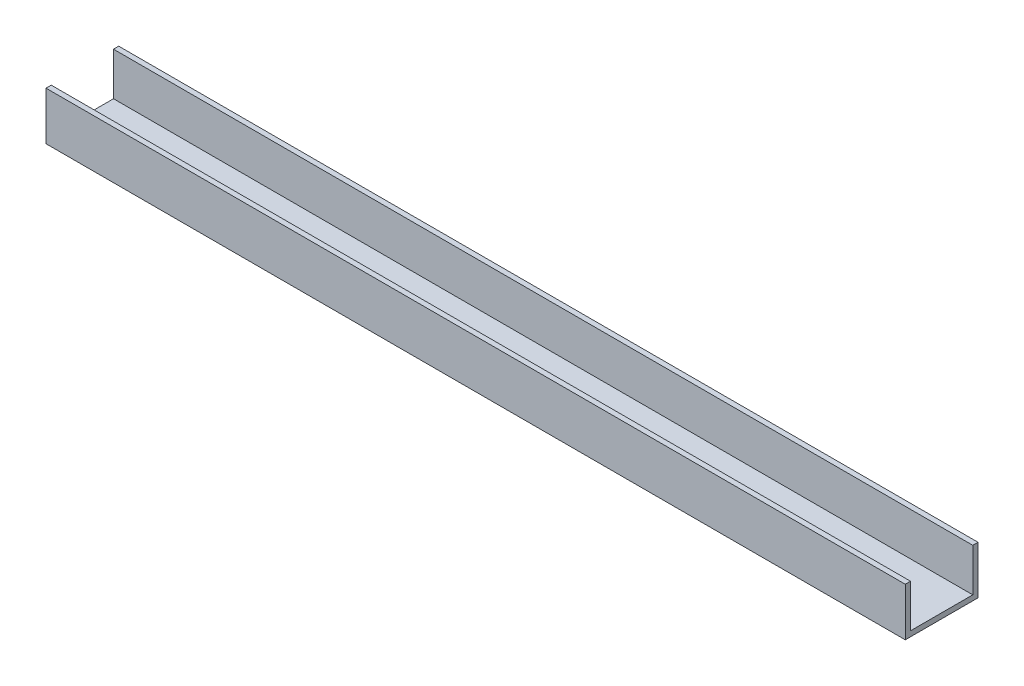
ISO-10303-21;
HEADER;
FILE_DESCRIPTION(('STEP AP214'),'2;1');
FILE_NAME('part.step','',(''),(''),'','','');
FILE_SCHEMA(('AUTOMOTIVE_DESIGN { 1 0 10303 214 1 1 1 1 }'));
ENDSEC;
DATA;
#1=APPLICATION_CONTEXT('core data for automotive mechanical design processes');
#2=APPLICATION_PROTOCOL_DEFINITION('international standard','automotive_design',2000,#1);
#3=PRODUCT_CONTEXT('',#1,'mechanical');
#4=PRODUCT('Part','Part','',(#3));
#5=PRODUCT_RELATED_PRODUCT_CATEGORY('part','',(#4));
#6=PRODUCT_DEFINITION_FORMATION('','',#4);
#7=PRODUCT_DEFINITION_CONTEXT('part definition',#1,'design');
#8=PRODUCT_DEFINITION('design','',#6,#7);
#9=PRODUCT_DEFINITION_SHAPE('','',#8);
#10=(LENGTH_UNIT() NAMED_UNIT(*) SI_UNIT(.MILLI.,.METRE.));
#11=(NAMED_UNIT(*) PLANE_ANGLE_UNIT() SI_UNIT($,.RADIAN.));
#12=(NAMED_UNIT(*) SI_UNIT($,.STERADIAN.) SOLID_ANGLE_UNIT());
#13=UNCERTAINTY_MEASURE_WITH_UNIT(LENGTH_MEASURE(1.E-05),#10,'distance_accuracy_value','');
#14=(GEOMETRIC_REPRESENTATION_CONTEXT(3) GLOBAL_UNCERTAINTY_ASSIGNED_CONTEXT((#13)) GLOBAL_UNIT_ASSIGNED_CONTEXT((#10,
#11,#12)) REPRESENTATION_CONTEXT('',''));
#15=CARTESIAN_POINT('',(0.,0.,0.));
#16=DIRECTION('',(0.,0.,1.));
#17=DIRECTION('',(1.,0.,0.));
#18=AXIS2_PLACEMENT_3D('',#15,#16,#17);
#19=CARTESIAN_POINT('',(262.89,1.6002,-9.525));
#20=DIRECTION('',(0.,0.,-1.));
#21=DIRECTION('',(0.,1.,0.));
#22=AXIS2_PLACEMENT_3D('',#19,#20,#21);
#23=PLANE('',#22);
#24=DIRECTION('',(0.,-1.,0.));
#25=VECTOR('',#24,1.);
#26=CARTESIAN_POINT('',(0.,1.6002,-9.525));
#27=LINE('',#26,#25);
#28=CARTESIAN_POINT('',(0.,14.732,-9.525));
#29=VERTEX_POINT('',#28);
#30=CARTESIAN_POINT('',(0.,1.6002,-9.525));
#31=VERTEX_POINT('',#30);
#32=EDGE_CURVE('E133',#29,#31,#27,.T.);
#33=ORIENTED_EDGE('',*,*,#32,.T.);
#34=DIRECTION('',(-1.,0.,0.));
#35=VECTOR('',#34,1.);
#36=CARTESIAN_POINT('',(262.89,1.6002,-9.525));
#37=LINE('',#36,#35);
#38=CARTESIAN_POINT('',(262.89,1.6002,-9.525));
#39=VERTEX_POINT('',#38);
#40=EDGE_CURVE('E11',#39,#31,#37,.T.);
#41=ORIENTED_EDGE('',*,*,#40,.F.);
#42=DIRECTION('',(0.,-1.,0.));
#43=VECTOR('',#42,1.);
#44=CARTESIAN_POINT('',(262.89,1.6002,-9.525));
#45=LINE('',#44,#43);
#46=CARTESIAN_POINT('',(262.89,14.732,-9.525));
#47=VERTEX_POINT('',#46);
#48=EDGE_CURVE('E147',#47,#39,#45,.T.);
#49=ORIENTED_EDGE('',*,*,#48,.F.);
#50=DIRECTION('',(-1.,0.,0.));
#51=VECTOR('',#50,1.);
#52=CARTESIAN_POINT('',(262.89,14.732,-9.525));
#53=LINE('',#52,#51);
#54=EDGE_CURVE('E129',#47,#29,#53,.T.);
#55=ORIENTED_EDGE('',*,*,#54,.T.);
#56=EDGE_LOOP('',(#33,#41,#49,#55));
#57=FACE_BOUND('',#56,.T.);
#58=ADVANCED_FACE('F37',(#57),#23,.F.);
#59=CARTESIAN_POINT('',(262.89,1.6002,-9.525));
#60=DIRECTION('',(0.,-1.,0.));
#61=DIRECTION('',(0.,0.,-1.));
#62=AXIS2_PLACEMENT_3D('',#59,#60,#61);
#63=PLANE('',#62);
#64=DIRECTION('',(0.,0.,1.));
#65=VECTOR('',#64,1.);
#66=CARTESIAN_POINT('',(0.,1.6002,-9.525));
#67=LINE('',#66,#65);
#68=CARTESIAN_POINT('',(0.,1.6002,9.525));
#69=VERTEX_POINT('',#68);
#70=EDGE_CURVE('E136',#31,#69,#67,.T.);
#71=ORIENTED_EDGE('',*,*,#70,.T.);
#72=DIRECTION('',(-1.,0.,0.));
#73=VECTOR('',#72,1.);
#74=CARTESIAN_POINT('',(262.89,1.6002,9.525));
#75=LINE('',#74,#73);
#76=CARTESIAN_POINT('',(262.89,1.6002,9.525));
#77=VERTEX_POINT('',#76);
#78=EDGE_CURVE('E45',#77,#69,#75,.T.);
#79=ORIENTED_EDGE('',*,*,#78,.F.);
#80=DIRECTION('',(0.,0.,1.));
#81=VECTOR('',#80,1.);
#82=CARTESIAN_POINT('',(262.89,1.6002,-9.525));
#83=LINE('',#82,#81);
#84=EDGE_CURVE('E96',#39,#77,#83,.T.);
#85=ORIENTED_EDGE('',*,*,#84,.F.);
#86=ORIENTED_EDGE('',*,*,#40,.T.);
#87=EDGE_LOOP('',(#71,#79,#85,#86));
#88=FACE_BOUND('',#87,.T.);
#89=ADVANCED_FACE('F182',(#88),#63,.F.);
#90=CARTESIAN_POINT('',(262.89,1.6002,9.525));
#91=DIRECTION('',(0.,0.,1.));
#92=DIRECTION('',(0.,-1.,0.));
#93=AXIS2_PLACEMENT_3D('',#90,#91,#92);
#94=PLANE('',#93);
#95=DIRECTION('',(0.,1.,0.));
#96=VECTOR('',#95,1.);
#97=CARTESIAN_POINT('',(0.,1.6002,9.525));
#98=LINE('',#97,#96);
#99=CARTESIAN_POINT('',(0.,14.732,9.525));
#100=VERTEX_POINT('',#99);
#101=EDGE_CURVE('E138',#69,#100,#98,.T.);
#102=ORIENTED_EDGE('',*,*,#101,.T.);
#103=DIRECTION('',(-1.,0.,0.));
#104=VECTOR('',#103,1.);
#105=CARTESIAN_POINT('',(262.89,14.732,9.525));
#106=LINE('',#105,#104);
#107=CARTESIAN_POINT('',(262.89,14.732,9.525));
#108=VERTEX_POINT('',#107);
#109=EDGE_CURVE('E154',#108,#100,#106,.T.);
#110=ORIENTED_EDGE('',*,*,#109,.F.);
#111=DIRECTION('',(0.,1.,0.));
#112=VECTOR('',#111,1.);
#113=CARTESIAN_POINT('',(262.89,1.6002,9.525));
#114=LINE('',#113,#112);
#115=EDGE_CURVE('E162',#77,#108,#114,.T.);
#116=ORIENTED_EDGE('',*,*,#115,.F.);
#117=ORIENTED_EDGE('',*,*,#78,.T.);
#118=EDGE_LOOP('',(#102,#110,#116,#117));
#119=FACE_BOUND('',#118,.T.);
#120=ADVANCED_FACE('F160',(#119),#94,.F.);
#121=CARTESIAN_POINT('',(262.89,14.732,9.525));
#122=DIRECTION('',(0.,-1.,0.));
#123=DIRECTION('',(0.,0.,-1.));
#124=AXIS2_PLACEMENT_3D('',#121,#122,#123);
#125=PLANE('',#124);
#126=DIRECTION('',(0.,0.,1.));
#127=VECTOR('',#126,1.);
#128=CARTESIAN_POINT('',(0.,14.732,9.525));
#129=LINE('',#128,#127);
#130=CARTESIAN_POINT('',(0.,14.732,11.1252));
#131=VERTEX_POINT('',#130);
#132=EDGE_CURVE('E140',#100,#131,#129,.T.);
#133=ORIENTED_EDGE('',*,*,#132,.T.);
#134=DIRECTION('',(-1.,0.,0.));
#135=VECTOR('',#134,1.);
#136=CARTESIAN_POINT('',(262.89,14.732,11.1252));
#137=LINE('',#136,#135);
#138=CARTESIAN_POINT('',(262.89,14.732,11.1252));
#139=VERTEX_POINT('',#138);
#140=EDGE_CURVE('E151',#139,#131,#137,.T.);
#141=ORIENTED_EDGE('',*,*,#140,.F.);
#142=DIRECTION('',(0.,0.,1.));
#143=VECTOR('',#142,1.);
#144=CARTESIAN_POINT('',(262.89,14.732,9.525));
#145=LINE('',#144,#143);
#146=EDGE_CURVE('E174',#108,#139,#145,.T.);
#147=ORIENTED_EDGE('',*,*,#146,.F.);
#148=ORIENTED_EDGE('',*,*,#109,.T.);
#149=EDGE_LOOP('',(#133,#141,#147,#148));
#150=FACE_BOUND('',#149,.T.);
#151=ADVANCED_FACE('F170',(#150),#125,.F.);
#152=CARTESIAN_POINT('',(262.89,14.732,11.1252));
#153=DIRECTION('',(0.,0.,-1.));
#154=DIRECTION('',(0.,1.,0.));
#155=AXIS2_PLACEMENT_3D('',#152,#153,#154);
#156=PLANE('',#155);
#157=DIRECTION('',(0.,-1.,0.));
#158=VECTOR('',#157,1.);
#159=CARTESIAN_POINT('',(0.,14.732,11.1252));
#160=LINE('',#159,#158);
#161=CARTESIAN_POINT('',(0.,0.,11.1252));
#162=VERTEX_POINT('',#161);
#163=EDGE_CURVE('E142',#131,#162,#160,.T.);
#164=ORIENTED_EDGE('',*,*,#163,.T.);
#165=DIRECTION('',(-1.,0.,0.));
#166=VECTOR('',#165,1.);
#167=CARTESIAN_POINT('',(262.89,0.,11.1252));
#168=LINE('',#167,#166);
#169=CARTESIAN_POINT('',(262.89,0.,11.1252));
#170=VERTEX_POINT('',#169);
#171=EDGE_CURVE('E124',#170,#162,#168,.T.);
#172=ORIENTED_EDGE('',*,*,#171,.F.);
#173=DIRECTION('',(0.,-1.,0.));
#174=VECTOR('',#173,1.);
#175=CARTESIAN_POINT('',(262.89,14.732,11.1252));
#176=LINE('',#175,#174);
#177=EDGE_CURVE('E115',#139,#170,#176,.T.);
#178=ORIENTED_EDGE('',*,*,#177,.F.);
#179=ORIENTED_EDGE('',*,*,#140,.T.);
#180=EDGE_LOOP('',(#164,#172,#178,#179));
#181=FACE_BOUND('',#180,.T.);
#182=ADVANCED_FACE('F173',(#181),#156,.F.);
#183=CARTESIAN_POINT('',(262.89,0.,11.1252));
#184=DIRECTION('',(0.,1.,0.));
#185=DIRECTION('',(0.,0.,1.));
#186=AXIS2_PLACEMENT_3D('',#183,#184,#185);
#187=PLANE('',#186);
#188=DIRECTION('',(0.,0.,-1.));
#189=VECTOR('',#188,1.);
#190=CARTESIAN_POINT('',(0.,0.,11.1252));
#191=LINE('',#190,#189);
#192=CARTESIAN_POINT('',(0.,0.,-11.1252));
#193=VERTEX_POINT('',#192);
#194=EDGE_CURVE('E123',#162,#193,#191,.T.);
#195=ORIENTED_EDGE('',*,*,#194,.T.);
#196=DIRECTION('',(-1.,0.,0.));
#197=VECTOR('',#196,1.);
#198=CARTESIAN_POINT('',(262.89,0.,-11.1252));
#199=LINE('',#198,#197);
#200=CARTESIAN_POINT('',(262.89,0.,-11.1252));
#201=VERTEX_POINT('',#200);
#202=EDGE_CURVE('E120',#201,#193,#199,.T.);
#203=ORIENTED_EDGE('',*,*,#202,.F.);
#204=DIRECTION('',(0.,0.,-1.));
#205=VECTOR('',#204,1.);
#206=CARTESIAN_POINT('',(262.89,0.,11.1252));
#207=LINE('',#206,#205);
#208=EDGE_CURVE('E109',#170,#201,#207,.T.);
#209=ORIENTED_EDGE('',*,*,#208,.F.);
#210=ORIENTED_EDGE('',*,*,#171,.T.);
#211=EDGE_LOOP('',(#195,#203,#209,#210));
#212=FACE_BOUND('',#211,.T.);
#213=ADVANCED_FACE('F121',(#212),#187,.F.);
#214=CARTESIAN_POINT('',(262.89,14.732,-11.1252));
#215=DIRECTION('',(0.,0.,1.));
#216=DIRECTION('',(0.,-1.,0.));
#217=AXIS2_PLACEMENT_3D('',#214,#215,#216);
#218=PLANE('',#217);
#219=DIRECTION('',(0.,1.,0.));
#220=VECTOR('',#219,1.);
#221=CARTESIAN_POINT('',(0.,14.732,-11.1252));
#222=LINE('',#221,#220);
#223=CARTESIAN_POINT('',(0.,14.732,-11.1252));
#224=VERTEX_POINT('',#223);
#225=EDGE_CURVE('E82',#193,#224,#222,.T.);
#226=ORIENTED_EDGE('',*,*,#225,.T.);
#227=DIRECTION('',(-1.,0.,0.));
#228=VECTOR('',#227,1.);
#229=CARTESIAN_POINT('',(262.89,14.732,-11.1252));
#230=LINE('',#229,#228);
#231=CARTESIAN_POINT('',(262.89,14.732,-11.1252));
#232=VERTEX_POINT('',#231);
#233=EDGE_CURVE('E125',#232,#224,#230,.T.);
#234=ORIENTED_EDGE('',*,*,#233,.F.);
#235=DIRECTION('',(0.,1.,0.));
#236=VECTOR('',#235,1.);
#237=CARTESIAN_POINT('',(262.89,14.732,-11.1252));
#238=LINE('',#237,#236);
#239=EDGE_CURVE('E113',#201,#232,#238,.T.);
#240=ORIENTED_EDGE('',*,*,#239,.F.);
#241=ORIENTED_EDGE('',*,*,#202,.T.);
#242=EDGE_LOOP('',(#226,#234,#240,#241));
#243=FACE_BOUND('',#242,.T.);
#244=ADVANCED_FACE('F127',(#243),#218,.F.);
#245=CARTESIAN_POINT('',(262.89,14.732,-9.525));
#246=DIRECTION('',(0.,-1.,0.));
#247=DIRECTION('',(0.,0.,-1.));
#248=AXIS2_PLACEMENT_3D('',#245,#246,#247);
#249=PLANE('',#248);
#250=DIRECTION('',(0.,0.,1.));
#251=VECTOR('',#250,1.);
#252=CARTESIAN_POINT('',(0.,14.732,-9.525));
#253=LINE('',#252,#251);
#254=EDGE_CURVE('E88',#224,#29,#253,.T.);
#255=ORIENTED_EDGE('',*,*,#254,.T.);
#256=ORIENTED_EDGE('',*,*,#54,.F.);
#257=DIRECTION('',(0.,0.,1.));
#258=VECTOR('',#257,1.);
#259=CARTESIAN_POINT('',(262.89,14.732,-9.525));
#260=LINE('',#259,#258);
#261=EDGE_CURVE('E53',#232,#47,#260,.T.);
#262=ORIENTED_EDGE('',*,*,#261,.F.);
#263=ORIENTED_EDGE('',*,*,#233,.T.);
#264=EDGE_LOOP('',(#255,#256,#262,#263));
#265=FACE_BOUND('',#264,.T.);
#266=ADVANCED_FACE('F198',(#265),#249,.F.);
#267=CARTESIAN_POINT('',(262.89,0.,0.));
#268=DIRECTION('',(-1.,0.,0.));
#269=DIRECTION('',(0.,0.,1.));
#270=AXIS2_PLACEMENT_3D('',#267,#268,#269);
#271=PLANE('',#270);
#272=ORIENTED_EDGE('',*,*,#48,.T.);
#273=ORIENTED_EDGE('',*,*,#84,.T.);
#274=ORIENTED_EDGE('',*,*,#115,.T.);
#275=ORIENTED_EDGE('',*,*,#146,.T.);
#276=ORIENTED_EDGE('',*,*,#177,.T.);
#277=ORIENTED_EDGE('',*,*,#208,.T.);
#278=ORIENTED_EDGE('',*,*,#239,.T.);
#279=ORIENTED_EDGE('',*,*,#261,.T.);
#280=EDGE_LOOP('',(#272,#273,#274,#275,#276,#277,#278,#279));
#281=FACE_BOUND('',#280,.T.);
#282=ADVANCED_FACE('F111',(#281),#271,.F.);
#283=CARTESIAN_POINT('',(0.,0.,0.));
#284=DIRECTION('',(-1.,0.,0.));
#285=DIRECTION('',(0.,0.,1.));
#286=AXIS2_PLACEMENT_3D('',#283,#284,#285);
#287=PLANE('',#286);
#288=ORIENTED_EDGE('',*,*,#32,.F.);
#289=ORIENTED_EDGE('',*,*,#254,.F.);
#290=ORIENTED_EDGE('',*,*,#225,.F.);
#291=ORIENTED_EDGE('',*,*,#194,.F.);
#292=ORIENTED_EDGE('',*,*,#163,.F.);
#293=ORIENTED_EDGE('',*,*,#132,.F.);
#294=ORIENTED_EDGE('',*,*,#101,.F.);
#295=ORIENTED_EDGE('',*,*,#70,.F.);
#296=EDGE_LOOP('',(#288,#289,#290,#291,#292,#293,#294,#295));
#297=FACE_BOUND('',#296,.T.);
#298=ADVANCED_FACE('F166',(#297),#287,.T.);
#299=CLOSED_SHELL('',(#58,#89,#120,#151,#182,#213,#244,#266,#282,#298));
#300=MANIFOLD_SOLID_BREP('B2',#299);
#301=ADVANCED_BREP_SHAPE_REPRESENTATION('',(#18,#300),#14);
#302=SHAPE_DEFINITION_REPRESENTATION(#9,#301);
ENDSEC;
END-ISO-10303-21;
